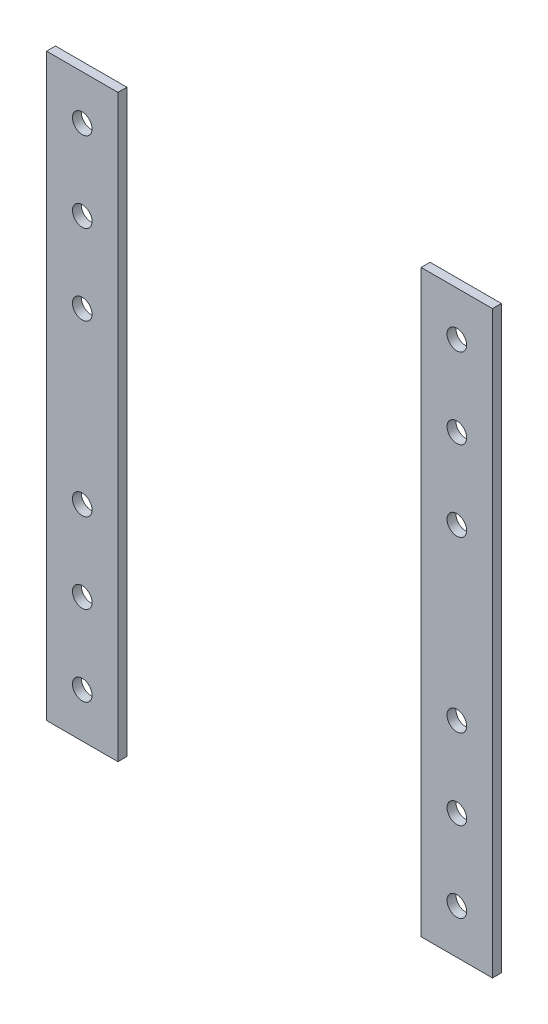
ISO-10303-21;
HEADER;
FILE_DESCRIPTION(('STEP AP214'),'2;1');
FILE_NAME('part.step','',(''),(''),'','','');
FILE_SCHEMA(('AUTOMOTIVE_DESIGN { 1 0 10303 214 1 1 1 1 }'));
ENDSEC;
DATA;
#1=APPLICATION_CONTEXT('core data for automotive mechanical design processes');
#2=APPLICATION_PROTOCOL_DEFINITION('international standard','automotive_design',2000,#1);
#3=PRODUCT_CONTEXT('',#1,'mechanical');
#4=PRODUCT('Part','Part','',(#3));
#5=PRODUCT_RELATED_PRODUCT_CATEGORY('part','',(#4));
#6=PRODUCT_DEFINITION_FORMATION('','',#4);
#7=PRODUCT_DEFINITION_CONTEXT('part definition',#1,'design');
#8=PRODUCT_DEFINITION('design','',#6,#7);
#9=PRODUCT_DEFINITION_SHAPE('','',#8);
#10=(LENGTH_UNIT() NAMED_UNIT(*) SI_UNIT(.MILLI.,.METRE.));
#11=(NAMED_UNIT(*) PLANE_ANGLE_UNIT() SI_UNIT($,.RADIAN.));
#12=(NAMED_UNIT(*) SI_UNIT($,.STERADIAN.) SOLID_ANGLE_UNIT());
#13=UNCERTAINTY_MEASURE_WITH_UNIT(LENGTH_MEASURE(1.E-05),#10,'distance_accuracy_value','');
#14=(GEOMETRIC_REPRESENTATION_CONTEXT(3) GLOBAL_UNCERTAINTY_ASSIGNED_CONTEXT((#13)) GLOBAL_UNIT_ASSIGNED_CONTEXT((#10,
#11,#12)) REPRESENTATION_CONTEXT('',''));
#15=CARTESIAN_POINT('',(0.,0.,0.));
#16=DIRECTION('',(0.,0.,1.));
#17=DIRECTION('',(1.,0.,0.));
#18=AXIS2_PLACEMENT_3D('',#15,#16,#17);
#19=CARTESIAN_POINT('',(0.,0.,-1550.05000079646));
#20=DIRECTION('',(0.,0.,-1.));
#21=DIRECTION('',(-1.,0.,0.));
#22=AXIS2_PLACEMENT_3D('',#19,#20,#21);
#23=PLANE('',#22);
#24=CARTESIAN_POINT('',(42.0000000000001,845.,-1550.05000079646));
#25=DIRECTION('',(0.,0.,1.));
#26=DIRECTION('',(1.,0.,0.));
#27=AXIS2_PLACEMENT_3D('',#24,#25,#26);
#28=CIRCLE('',#27,2.19999999999999);
#29=CARTESIAN_POINT('',(44.2000000000001,845.,-1550.05000079646));
#30=VERTEX_POINT('',#29);
#31=EDGE_CURVE('E367',#30,#30,#28,.T.);
#32=ORIENTED_EDGE('',*,*,#31,.F.);
#33=EDGE_LOOP('',(#32));
#34=FACE_BOUND('',#33,.T.);
#35=CARTESIAN_POINT('',(42.0000000000001,827.,-1550.05000079646));
#36=DIRECTION('',(0.,0.,1.));
#37=DIRECTION('',(1.,0.,0.));
#38=AXIS2_PLACEMENT_3D('',#35,#36,#37);
#39=CIRCLE('',#38,2.19999999999999);
#40=CARTESIAN_POINT('',(44.2000000000001,827.,-1550.05000079646));
#41=VERTEX_POINT('',#40);
#42=EDGE_CURVE('E371',#41,#41,#39,.T.);
#43=ORIENTED_EDGE('',*,*,#42,.F.);
#44=EDGE_LOOP('',(#43));
#45=FACE_BOUND('',#44,.T.);
#46=CARTESIAN_POINT('',(42.0000000000001,809.,-1550.05000079646));
#47=DIRECTION('',(0.,0.,1.));
#48=DIRECTION('',(1.,0.,0.));
#49=AXIS2_PLACEMENT_3D('',#46,#47,#48);
#50=CIRCLE('',#49,2.19999999999999);
#51=CARTESIAN_POINT('',(44.2000000000001,809.,-1550.05000079646));
#52=VERTEX_POINT('',#51);
#53=EDGE_CURVE('E380',#52,#52,#50,.T.);
#54=ORIENTED_EDGE('',*,*,#53,.F.);
#55=EDGE_LOOP('',(#54));
#56=FACE_BOUND('',#55,.T.);
#57=CARTESIAN_POINT('',(42.0000000000001,771.,-1550.05000079646));
#58=DIRECTION('',(0.,0.,1.));
#59=DIRECTION('',(1.,0.,0.));
#60=AXIS2_PLACEMENT_3D('',#57,#58,#59);
#61=CIRCLE('',#60,2.19999999999999);
#62=CARTESIAN_POINT('',(44.2000000000001,771.,-1550.05000079646));
#63=VERTEX_POINT('',#62);
#64=EDGE_CURVE('E386',#63,#63,#61,.T.);
#65=ORIENTED_EDGE('',*,*,#64,.F.);
#66=EDGE_LOOP('',(#65));
#67=FACE_BOUND('',#66,.T.);
#68=CARTESIAN_POINT('',(42.0000000000001,753.,-1550.05000079646));
#69=DIRECTION('',(0.,0.,1.));
#70=DIRECTION('',(1.,0.,0.));
#71=AXIS2_PLACEMENT_3D('',#68,#69,#70);
#72=CIRCLE('',#71,2.19999999999999);
#73=CARTESIAN_POINT('',(44.2000000000001,753.,-1550.05000079646));
#74=VERTEX_POINT('',#73);
#75=EDGE_CURVE('E392',#74,#74,#72,.T.);
#76=ORIENTED_EDGE('',*,*,#75,.F.);
#77=EDGE_LOOP('',(#76));
#78=FACE_BOUND('',#77,.T.);
#79=CARTESIAN_POINT('',(42.0000000000001,735.,-1550.05000079646));
#80=DIRECTION('',(0.,0.,1.));
#81=DIRECTION('',(1.,0.,0.));
#82=AXIS2_PLACEMENT_3D('',#79,#80,#81);
#83=CIRCLE('',#82,2.19999999999999);
#84=CARTESIAN_POINT('',(44.2000000000001,735.,-1550.05000079646));
#85=VERTEX_POINT('',#84);
#86=EDGE_CURVE('E273',#85,#85,#83,.T.);
#87=ORIENTED_EDGE('',*,*,#86,.F.);
#88=EDGE_LOOP('',(#87));
#89=FACE_BOUND('',#88,.T.);
#90=DIRECTION('',(-1.,0.,0.));
#91=VECTOR('',#90,1.);
#92=CARTESIAN_POINT('',(50.0000000000001,855.,-1550.05000079646));
#93=LINE('',#92,#91);
#94=CARTESIAN_POINT('',(50.0000000000001,855.,-1550.05000079646));
#95=VERTEX_POINT('',#94);
#96=CARTESIAN_POINT('',(34.0000000000001,855.,-1550.05000079646));
#97=VERTEX_POINT('',#96);
#98=EDGE_CURVE('E226',#95,#97,#93,.T.);
#99=ORIENTED_EDGE('',*,*,#98,.T.);
#100=DIRECTION('',(0.,-1.,0.));
#101=VECTOR('',#100,1.);
#102=CARTESIAN_POINT('',(34.0000000000001,855.,-1550.05000079646));
#103=LINE('',#102,#101);
#104=CARTESIAN_POINT('',(34.0000000000001,725.,-1550.05000079646));
#105=VERTEX_POINT('',#104);
#106=EDGE_CURVE('E283',#97,#105,#103,.T.);
#107=ORIENTED_EDGE('',*,*,#106,.T.);
#108=DIRECTION('',(-1.,0.,0.));
#109=VECTOR('',#108,1.);
#110=CARTESIAN_POINT('',(50.0000000000001,725.,-1550.05000079646));
#111=LINE('',#110,#109);
#112=CARTESIAN_POINT('',(50.0000000000001,725.,-1550.05000079646));
#113=VERTEX_POINT('',#112);
#114=EDGE_CURVE('E272',#113,#105,#111,.T.);
#115=ORIENTED_EDGE('',*,*,#114,.F.);
#116=DIRECTION('',(0.,-1.,0.));
#117=VECTOR('',#116,1.);
#118=CARTESIAN_POINT('',(50.0000000000001,855.,-1550.05000079646));
#119=LINE('',#118,#117);
#120=EDGE_CURVE('E255',#95,#113,#119,.T.);
#121=ORIENTED_EDGE('',*,*,#120,.F.);
#122=EDGE_LOOP('',(#99,#107,#115,#121));
#123=FACE_BOUND('',#122,.T.);
#124=ADVANCED_FACE('F217',(#34,#45,#56,#67,#78,#89,#123),#23,.F.);
#125=CARTESIAN_POINT('',(0.,0.,-1552.05000079646));
#126=DIRECTION('',(0.,0.,-1.));
#127=DIRECTION('',(-1.,0.,0.));
#128=AXIS2_PLACEMENT_3D('',#125,#126,#127);
#129=PLANE('',#128);
#130=CARTESIAN_POINT('',(42.0000000000001,845.,-1552.05000079646));
#131=DIRECTION('',(0.,0.,1.));
#132=DIRECTION('',(1.,0.,0.));
#133=AXIS2_PLACEMENT_3D('',#130,#131,#132);
#134=CIRCLE('',#133,2.19999999999999);
#135=CARTESIAN_POINT('',(44.2000000000001,845.,-1552.05000079646));
#136=VERTEX_POINT('',#135);
#137=EDGE_CURVE('E364',#136,#136,#134,.T.);
#138=ORIENTED_EDGE('',*,*,#137,.T.);
#139=EDGE_LOOP('',(#138));
#140=FACE_BOUND('',#139,.T.);
#141=CARTESIAN_POINT('',(42.0000000000001,827.,-1552.05000079646));
#142=DIRECTION('',(0.,0.,1.));
#143=DIRECTION('',(1.,0.,0.));
#144=AXIS2_PLACEMENT_3D('',#141,#142,#143);
#145=CIRCLE('',#144,2.19999999999999);
#146=CARTESIAN_POINT('',(44.2000000000001,827.,-1552.05000079646));
#147=VERTEX_POINT('',#146);
#148=EDGE_CURVE('E368',#147,#147,#145,.T.);
#149=ORIENTED_EDGE('',*,*,#148,.T.);
#150=EDGE_LOOP('',(#149));
#151=FACE_BOUND('',#150,.T.);
#152=CARTESIAN_POINT('',(42.0000000000001,809.,-1552.05000079646));
#153=DIRECTION('',(0.,0.,1.));
#154=DIRECTION('',(1.,0.,0.));
#155=AXIS2_PLACEMENT_3D('',#152,#153,#154);
#156=CIRCLE('',#155,2.19999999999999);
#157=CARTESIAN_POINT('',(44.2000000000001,809.,-1552.05000079646));
#158=VERTEX_POINT('',#157);
#159=EDGE_CURVE('E377',#158,#158,#156,.T.);
#160=ORIENTED_EDGE('',*,*,#159,.T.);
#161=EDGE_LOOP('',(#160));
#162=FACE_BOUND('',#161,.T.);
#163=CARTESIAN_POINT('',(42.0000000000001,771.,-1552.05000079646));
#164=DIRECTION('',(0.,0.,1.));
#165=DIRECTION('',(1.,0.,0.));
#166=AXIS2_PLACEMENT_3D('',#163,#164,#165);
#167=CIRCLE('',#166,2.19999999999999);
#168=CARTESIAN_POINT('',(44.2000000000001,771.,-1552.05000079646));
#169=VERTEX_POINT('',#168);
#170=EDGE_CURVE('E383',#169,#169,#167,.T.);
#171=ORIENTED_EDGE('',*,*,#170,.T.);
#172=EDGE_LOOP('',(#171));
#173=FACE_BOUND('',#172,.T.);
#174=CARTESIAN_POINT('',(42.0000000000001,753.,-1552.05000079646));
#175=DIRECTION('',(0.,0.,1.));
#176=DIRECTION('',(1.,0.,0.));
#177=AXIS2_PLACEMENT_3D('',#174,#175,#176);
#178=CIRCLE('',#177,2.19999999999999);
#179=CARTESIAN_POINT('',(44.2000000000001,753.,-1552.05000079646));
#180=VERTEX_POINT('',#179);
#181=EDGE_CURVE('E389',#180,#180,#178,.T.);
#182=ORIENTED_EDGE('',*,*,#181,.T.);
#183=EDGE_LOOP('',(#182));
#184=FACE_BOUND('',#183,.T.);
#185=CARTESIAN_POINT('',(42.0000000000001,735.,-1552.05000079646));
#186=DIRECTION('',(0.,0.,1.));
#187=DIRECTION('',(1.,0.,0.));
#188=AXIS2_PLACEMENT_3D('',#185,#186,#187);
#189=CIRCLE('',#188,2.19999999999999);
#190=CARTESIAN_POINT('',(44.2000000000001,735.,-1552.05000079646));
#191=VERTEX_POINT('',#190);
#192=EDGE_CURVE('E276',#191,#191,#189,.T.);
#193=ORIENTED_EDGE('',*,*,#192,.T.);
#194=EDGE_LOOP('',(#193));
#195=FACE_BOUND('',#194,.T.);
#196=DIRECTION('',(-1.,0.,0.));
#197=VECTOR('',#196,1.);
#198=CARTESIAN_POINT('',(50.0000000000001,855.,-1552.05000079646));
#199=LINE('',#198,#197);
#200=CARTESIAN_POINT('',(50.0000000000001,855.,-1552.05000079646));
#201=VERTEX_POINT('',#200);
#202=CARTESIAN_POINT('',(34.0000000000001,855.,-1552.05000079646));
#203=VERTEX_POINT('',#202);
#204=EDGE_CURVE('E13',#201,#203,#199,.T.);
#205=ORIENTED_EDGE('',*,*,#204,.F.);
#206=DIRECTION('',(0.,-1.,0.));
#207=VECTOR('',#206,1.);
#208=CARTESIAN_POINT('',(50.0000000000001,855.,-1552.05000079646));
#209=LINE('',#208,#207);
#210=CARTESIAN_POINT('',(50.0000000000001,725.,-1552.05000079646));
#211=VERTEX_POINT('',#210);
#212=EDGE_CURVE('E269',#201,#211,#209,.T.);
#213=ORIENTED_EDGE('',*,*,#212,.T.);
#214=DIRECTION('',(-1.,0.,0.));
#215=VECTOR('',#214,1.);
#216=CARTESIAN_POINT('',(50.0000000000001,725.,-1552.05000079646));
#217=LINE('',#216,#215);
#218=CARTESIAN_POINT('',(34.0000000000001,725.,-1552.05000079646));
#219=VERTEX_POINT('',#218);
#220=EDGE_CURVE('E290',#211,#219,#217,.T.);
#221=ORIENTED_EDGE('',*,*,#220,.T.);
#222=DIRECTION('',(0.,-1.,0.));
#223=VECTOR('',#222,1.);
#224=CARTESIAN_POINT('',(34.0000000000001,855.,-1552.05000079646));
#225=LINE('',#224,#223);
#226=EDGE_CURVE('E265',#203,#219,#225,.T.);
#227=ORIENTED_EDGE('',*,*,#226,.F.);
#228=EDGE_LOOP('',(#205,#213,#221,#227));
#229=FACE_BOUND('',#228,.T.);
#230=ADVANCED_FACE('F317',(#140,#151,#162,#173,#184,#195,#229),#129,.T.);
#231=CARTESIAN_POINT('',(50.0000000000001,855.,-1552.05000079646));
#232=DIRECTION('',(-1.,0.,0.));
#233=DIRECTION('',(0.,0.,1.));
#234=AXIS2_PLACEMENT_3D('',#231,#232,#233);
#235=PLANE('',#234);
#236=ORIENTED_EDGE('',*,*,#120,.T.);
#237=DIRECTION('',(0.,0.,1.));
#238=VECTOR('',#237,1.);
#239=CARTESIAN_POINT('',(50.0000000000001,725.,-1552.05000079646));
#240=LINE('',#239,#238);
#241=EDGE_CURVE('E298',#211,#113,#240,.T.);
#242=ORIENTED_EDGE('',*,*,#241,.F.);
#243=ORIENTED_EDGE('',*,*,#212,.F.);
#244=DIRECTION('',(0.,0.,1.));
#245=VECTOR('',#244,1.);
#246=CARTESIAN_POINT('',(50.0000000000001,855.,-1552.05000079646));
#247=LINE('',#246,#245);
#248=EDGE_CURVE('E260',#201,#95,#247,.T.);
#249=ORIENTED_EDGE('',*,*,#248,.T.);
#250=EDGE_LOOP('',(#236,#242,#243,#249));
#251=FACE_BOUND('',#250,.T.);
#252=ADVANCED_FACE('F267',(#251),#235,.F.);
#253=CARTESIAN_POINT('',(50.0000000000001,725.,-1552.05000079646));
#254=DIRECTION('',(0.,1.,0.));
#255=DIRECTION('',(0.,0.,1.));
#256=AXIS2_PLACEMENT_3D('',#253,#254,#255);
#257=PLANE('',#256);
#258=ORIENTED_EDGE('',*,*,#114,.T.);
#259=DIRECTION('',(0.,0.,1.));
#260=VECTOR('',#259,1.);
#261=CARTESIAN_POINT('',(34.0000000000001,725.,-1552.05000079646));
#262=LINE('',#261,#260);
#263=EDGE_CURVE('E285',#219,#105,#262,.T.);
#264=ORIENTED_EDGE('',*,*,#263,.F.);
#265=ORIENTED_EDGE('',*,*,#220,.F.);
#266=ORIENTED_EDGE('',*,*,#241,.T.);
#267=EDGE_LOOP('',(#258,#264,#265,#266));
#268=FACE_BOUND('',#267,.T.);
#269=ADVANCED_FACE('F316',(#268),#257,.F.);
#270=CARTESIAN_POINT('',(50.0000000000001,855.,-1552.05000079646));
#271=DIRECTION('',(0.,1.,0.));
#272=DIRECTION('',(0.,0.,1.));
#273=AXIS2_PLACEMENT_3D('',#270,#271,#272);
#274=PLANE('',#273);
#275=ORIENTED_EDGE('',*,*,#98,.F.);
#276=ORIENTED_EDGE('',*,*,#248,.F.);
#277=ORIENTED_EDGE('',*,*,#204,.T.);
#278=DIRECTION('',(0.,0.,1.));
#279=VECTOR('',#278,1.);
#280=CARTESIAN_POINT('',(34.0000000000001,855.,-1552.05000079646));
#281=LINE('',#280,#279);
#282=EDGE_CURVE('E262',#203,#97,#281,.T.);
#283=ORIENTED_EDGE('',*,*,#282,.T.);
#284=EDGE_LOOP('',(#275,#276,#277,#283));
#285=FACE_BOUND('',#284,.T.);
#286=ADVANCED_FACE('F259',(#285),#274,.T.);
#287=CARTESIAN_POINT('',(34.0000000000001,855.,-1552.05000079646));
#288=DIRECTION('',(-1.,0.,0.));
#289=DIRECTION('',(0.,0.,1.));
#290=AXIS2_PLACEMENT_3D('',#287,#288,#289);
#291=PLANE('',#290);
#292=ORIENTED_EDGE('',*,*,#106,.F.);
#293=ORIENTED_EDGE('',*,*,#282,.F.);
#294=ORIENTED_EDGE('',*,*,#226,.T.);
#295=ORIENTED_EDGE('',*,*,#263,.T.);
#296=EDGE_LOOP('',(#292,#293,#294,#295));
#297=FACE_BOUND('',#296,.T.);
#298=ADVANCED_FACE('F315',(#297),#291,.T.);
#299=CARTESIAN_POINT('',(42.0000000000001,735.,-1552.05000079646));
#300=DIRECTION('',(0.,0.,1.));
#301=DIRECTION('',(1.,0.,0.));
#302=AXIS2_PLACEMENT_3D('',#299,#300,#301);
#303=CYLINDRICAL_SURFACE('',#302,2.19999999999999);
#304=ORIENTED_EDGE('',*,*,#192,.F.);
#305=EDGE_LOOP('',(#304));
#306=FACE_BOUND('',#305,.T.);
#307=ORIENTED_EDGE('',*,*,#86,.T.);
#308=EDGE_LOOP('',(#307));
#309=FACE_BOUND('',#308,.T.);
#310=ADVANCED_FACE('F326',(#306,#309),#303,.F.);
#311=CARTESIAN_POINT('',(42.0000000000001,753.,-1552.05000079646));
#312=DIRECTION('',(0.,0.,1.));
#313=DIRECTION('',(1.,0.,0.));
#314=AXIS2_PLACEMENT_3D('',#311,#312,#313);
#315=CYLINDRICAL_SURFACE('',#314,2.19999999999999);
#316=ORIENTED_EDGE('',*,*,#181,.F.);
#317=EDGE_LOOP('',(#316));
#318=FACE_BOUND('',#317,.T.);
#319=ORIENTED_EDGE('',*,*,#75,.T.);
#320=EDGE_LOOP('',(#319));
#321=FACE_BOUND('',#320,.T.);
#322=ADVANCED_FACE('F336',(#318,#321),#315,.F.);
#323=CARTESIAN_POINT('',(42.0000000000001,771.,-1552.05000079646));
#324=DIRECTION('',(0.,0.,1.));
#325=DIRECTION('',(1.,0.,0.));
#326=AXIS2_PLACEMENT_3D('',#323,#324,#325);
#327=CYLINDRICAL_SURFACE('',#326,2.19999999999999);
#328=ORIENTED_EDGE('',*,*,#170,.F.);
#329=EDGE_LOOP('',(#328));
#330=FACE_BOUND('',#329,.T.);
#331=ORIENTED_EDGE('',*,*,#64,.T.);
#332=EDGE_LOOP('',(#331));
#333=FACE_BOUND('',#332,.T.);
#334=ADVANCED_FACE('F344',(#330,#333),#327,.F.);
#335=CARTESIAN_POINT('',(42.0000000000001,809.,-1552.05000079646));
#336=DIRECTION('',(0.,0.,1.));
#337=DIRECTION('',(1.,0.,0.));
#338=AXIS2_PLACEMENT_3D('',#335,#336,#337);
#339=CYLINDRICAL_SURFACE('',#338,2.19999999999999);
#340=ORIENTED_EDGE('',*,*,#159,.F.);
#341=EDGE_LOOP('',(#340));
#342=FACE_BOUND('',#341,.T.);
#343=ORIENTED_EDGE('',*,*,#53,.T.);
#344=EDGE_LOOP('',(#343));
#345=FACE_BOUND('',#344,.T.);
#346=ADVANCED_FACE('F348',(#342,#345),#339,.F.);
#347=CARTESIAN_POINT('',(42.0000000000001,827.,-1552.05000079646));
#348=DIRECTION('',(0.,0.,1.));
#349=DIRECTION('',(1.,0.,0.));
#350=AXIS2_PLACEMENT_3D('',#347,#348,#349);
#351=CYLINDRICAL_SURFACE('',#350,2.19999999999999);
#352=ORIENTED_EDGE('',*,*,#148,.F.);
#353=EDGE_LOOP('',(#352));
#354=FACE_BOUND('',#353,.T.);
#355=ORIENTED_EDGE('',*,*,#42,.T.);
#356=EDGE_LOOP('',(#355));
#357=FACE_BOUND('',#356,.T.);
#358=ADVANCED_FACE('F352',(#354,#357),#351,.F.);
#359=CARTESIAN_POINT('',(42.0000000000001,845.,-1552.05000079646));
#360=DIRECTION('',(0.,0.,1.));
#361=DIRECTION('',(1.,0.,0.));
#362=AXIS2_PLACEMENT_3D('',#359,#360,#361);
#363=CYLINDRICAL_SURFACE('',#362,2.19999999999999);
#364=ORIENTED_EDGE('',*,*,#137,.F.);
#365=EDGE_LOOP('',(#364));
#366=FACE_BOUND('',#365,.T.);
#367=ORIENTED_EDGE('',*,*,#31,.T.);
#368=EDGE_LOOP('',(#367));
#369=FACE_BOUND('',#368,.T.);
#370=ADVANCED_FACE('F356',(#366,#369),#363,.F.);
#371=CLOSED_SHELL('',(#124,#230,#252,#269,#286,#298,#310,#322,#334,#346,#358,#370));
#372=MANIFOLD_SOLID_BREP('B2',#371);
#373=CARTESIAN_POINT('',(0.,0.,-1550.05000079646));
#374=DIRECTION('',(0.,0.,-1.));
#375=DIRECTION('',(-1.,0.,0.));
#376=AXIS2_PLACEMENT_3D('',#373,#374,#375);
#377=PLANE('',#376);
#378=CARTESIAN_POINT('',(-42.0000000000001,735.,-1550.05000079646));
#379=DIRECTION('',(0.,0.,1.));
#380=DIRECTION('',(1.,0.,0.));
#381=AXIS2_PLACEMENT_3D('',#378,#379,#380);
#382=CIRCLE('',#381,2.19999999999999);
#383=CARTESIAN_POINT('',(-39.8000000000001,735.,-1550.05000079646));
#384=VERTEX_POINT('',#383);
#385=EDGE_CURVE('E618',#384,#384,#382,.T.);
#386=ORIENTED_EDGE('',*,*,#385,.F.);
#387=EDGE_LOOP('',(#386));
#388=FACE_BOUND('',#387,.T.);
#389=CARTESIAN_POINT('',(-42.0000000000001,753.,-1550.05000079646));
#390=DIRECTION('',(0.,0.,1.));
#391=DIRECTION('',(1.,0.,0.));
#392=AXIS2_PLACEMENT_3D('',#389,#390,#391);
#393=CIRCLE('',#392,2.19999999999999);
#394=CARTESIAN_POINT('',(-39.8000000000001,753.,-1550.05000079646));
#395=VERTEX_POINT('',#394);
#396=EDGE_CURVE('E612',#395,#395,#393,.T.);
#397=ORIENTED_EDGE('',*,*,#396,.F.);
#398=EDGE_LOOP('',(#397));
#399=FACE_BOUND('',#398,.T.);
#400=CARTESIAN_POINT('',(-42.0000000000001,771.,-1550.05000079646));
#401=DIRECTION('',(0.,0.,1.));
#402=DIRECTION('',(1.,0.,0.));
#403=AXIS2_PLACEMENT_3D('',#400,#401,#402);
#404=CIRCLE('',#403,2.19999999999999);
#405=CARTESIAN_POINT('',(-39.8000000000001,771.,-1550.05000079646));
#406=VERTEX_POINT('',#405);
#407=EDGE_CURVE('E606',#406,#406,#404,.T.);
#408=ORIENTED_EDGE('',*,*,#407,.F.);
#409=EDGE_LOOP('',(#408));
#410=FACE_BOUND('',#409,.T.);
#411=CARTESIAN_POINT('',(-42.0000000000001,809.,-1550.05000079646));
#412=DIRECTION('',(0.,0.,1.));
#413=DIRECTION('',(1.,0.,0.));
#414=AXIS2_PLACEMENT_3D('',#411,#412,#413);
#415=CIRCLE('',#414,2.19999999999999);
#416=CARTESIAN_POINT('',(-39.8000000000001,809.,-1550.05000079646));
#417=VERTEX_POINT('',#416);
#418=EDGE_CURVE('E600',#417,#417,#415,.T.);
#419=ORIENTED_EDGE('',*,*,#418,.F.);
#420=EDGE_LOOP('',(#419));
#421=FACE_BOUND('',#420,.T.);
#422=CARTESIAN_POINT('',(-42.0000000000001,827.,-1550.05000079646));
#423=DIRECTION('',(0.,0.,1.));
#424=DIRECTION('',(1.,0.,0.));
#425=AXIS2_PLACEMENT_3D('',#422,#423,#424);
#426=CIRCLE('',#425,2.19999999999999);
#427=CARTESIAN_POINT('',(-39.8000000000001,827.,-1550.05000079646));
#428=VERTEX_POINT('',#427);
#429=EDGE_CURVE('E594',#428,#428,#426,.T.);
#430=ORIENTED_EDGE('',*,*,#429,.F.);
#431=EDGE_LOOP('',(#430));
#432=FACE_BOUND('',#431,.T.);
#433=CARTESIAN_POINT('',(-42.0000000000001,845.,-1550.05000079646));
#434=DIRECTION('',(0.,0.,1.));
#435=DIRECTION('',(1.,0.,0.));
#436=AXIS2_PLACEMENT_3D('',#433,#434,#435);
#437=CIRCLE('',#436,2.19999999999999);
#438=CARTESIAN_POINT('',(-39.8000000000001,845.,-1550.05000079646));
#439=VERTEX_POINT('',#438);
#440=EDGE_CURVE('E563',#439,#439,#437,.T.);
#441=ORIENTED_EDGE('',*,*,#440,.F.);
#442=EDGE_LOOP('',(#441));
#443=FACE_BOUND('',#442,.T.);
#444=DIRECTION('',(0.,-1.,0.));
#445=VECTOR('',#444,1.);
#446=CARTESIAN_POINT('',(-50.0000000000001,855.,-1550.05000079646));
#447=LINE('',#446,#445);
#448=CARTESIAN_POINT('',(-50.0000000000001,855.,-1550.05000079646));
#449=VERTEX_POINT('',#448);
#450=CARTESIAN_POINT('',(-50.0000000000001,725.,-1550.05000079646));
#451=VERTEX_POINT('',#450);
#452=EDGE_CURVE('E520',#449,#451,#447,.T.);
#453=ORIENTED_EDGE('',*,*,#452,.T.);
#454=DIRECTION('',(1.,0.,0.));
#455=VECTOR('',#454,1.);
#456=CARTESIAN_POINT('',(-50.0000000000001,725.,-1550.05000079646));
#457=LINE('',#456,#455);
#458=CARTESIAN_POINT('',(-34.0000000000001,725.,-1550.05000079646));
#459=VERTEX_POINT('',#458);
#460=EDGE_CURVE('E526',#451,#459,#457,.T.);
#461=ORIENTED_EDGE('',*,*,#460,.T.);
#462=DIRECTION('',(0.,-1.,0.));
#463=VECTOR('',#462,1.);
#464=CARTESIAN_POINT('',(-34.0000000000001,855.,-1550.05000079646));
#465=LINE('',#464,#463);
#466=CARTESIAN_POINT('',(-34.0000000000001,855.,-1550.05000079646));
#467=VERTEX_POINT('',#466);
#468=EDGE_CURVE('E550',#467,#459,#465,.T.);
#469=ORIENTED_EDGE('',*,*,#468,.F.);
#470=DIRECTION('',(1.,0.,0.));
#471=VECTOR('',#470,1.);
#472=CARTESIAN_POINT('',(-50.0000000000001,855.,-1550.05000079646));
#473=LINE('',#472,#471);
#474=EDGE_CURVE('E500',#449,#467,#473,.T.);
#475=ORIENTED_EDGE('',*,*,#474,.F.);
#476=EDGE_LOOP('',(#453,#461,#469,#475));
#477=FACE_BOUND('',#476,.T.);
#478=ADVANCED_FACE('F491',(#388,#399,#410,#421,#432,#443,#477),#377,.F.);
#479=CARTESIAN_POINT('',(0.,0.,-1552.05000079646));
#480=DIRECTION('',(0.,0.,-1.));
#481=DIRECTION('',(-1.,0.,0.));
#482=AXIS2_PLACEMENT_3D('',#479,#480,#481);
#483=PLANE('',#482);
#484=CARTESIAN_POINT('',(-42.0000000000001,735.,-1552.05000079646));
#485=DIRECTION('',(0.,0.,1.));
#486=DIRECTION('',(1.,0.,0.));
#487=AXIS2_PLACEMENT_3D('',#484,#485,#486);
#488=CIRCLE('',#487,2.19999999999999);
#489=CARTESIAN_POINT('',(-39.8000000000001,735.,-1552.05000079646));
#490=VERTEX_POINT('',#489);
#491=EDGE_CURVE('E621',#490,#490,#488,.T.);
#492=ORIENTED_EDGE('',*,*,#491,.T.);
#493=EDGE_LOOP('',(#492));
#494=FACE_BOUND('',#493,.T.);
#495=CARTESIAN_POINT('',(-42.0000000000001,753.,-1552.05000079646));
#496=DIRECTION('',(0.,0.,1.));
#497=DIRECTION('',(1.,0.,0.));
#498=AXIS2_PLACEMENT_3D('',#495,#496,#497);
#499=CIRCLE('',#498,2.19999999999999);
#500=CARTESIAN_POINT('',(-39.8000000000001,753.,-1552.05000079646));
#501=VERTEX_POINT('',#500);
#502=EDGE_CURVE('E615',#501,#501,#499,.T.);
#503=ORIENTED_EDGE('',*,*,#502,.T.);
#504=EDGE_LOOP('',(#503));
#505=FACE_BOUND('',#504,.T.);
#506=CARTESIAN_POINT('',(-42.0000000000001,771.,-1552.05000079646));
#507=DIRECTION('',(0.,0.,1.));
#508=DIRECTION('',(1.,0.,0.));
#509=AXIS2_PLACEMENT_3D('',#506,#507,#508);
#510=CIRCLE('',#509,2.19999999999999);
#511=CARTESIAN_POINT('',(-39.8000000000001,771.,-1552.05000079646));
#512=VERTEX_POINT('',#511);
#513=EDGE_CURVE('E609',#512,#512,#510,.T.);
#514=ORIENTED_EDGE('',*,*,#513,.T.);
#515=EDGE_LOOP('',(#514));
#516=FACE_BOUND('',#515,.T.);
#517=CARTESIAN_POINT('',(-42.0000000000001,809.,-1552.05000079646));
#518=DIRECTION('',(0.,0.,1.));
#519=DIRECTION('',(1.,0.,0.));
#520=AXIS2_PLACEMENT_3D('',#517,#518,#519);
#521=CIRCLE('',#520,2.19999999999999);
#522=CARTESIAN_POINT('',(-39.8000000000001,809.,-1552.05000079646));
#523=VERTEX_POINT('',#522);
#524=EDGE_CURVE('E603',#523,#523,#521,.T.);
#525=ORIENTED_EDGE('',*,*,#524,.T.);
#526=EDGE_LOOP('',(#525));
#527=FACE_BOUND('',#526,.T.);
#528=CARTESIAN_POINT('',(-42.0000000000001,827.,-1552.05000079646));
#529=DIRECTION('',(0.,0.,1.));
#530=DIRECTION('',(1.,0.,0.));
#531=AXIS2_PLACEMENT_3D('',#528,#529,#530);
#532=CIRCLE('',#531,2.19999999999999);
#533=CARTESIAN_POINT('',(-39.8000000000001,827.,-1552.05000079646));
#534=VERTEX_POINT('',#533);
#535=EDGE_CURVE('E597',#534,#534,#532,.T.);
#536=ORIENTED_EDGE('',*,*,#535,.T.);
#537=EDGE_LOOP('',(#536));
#538=FACE_BOUND('',#537,.T.);
#539=CARTESIAN_POINT('',(-42.0000000000001,845.,-1552.05000079646));
#540=DIRECTION('',(0.,0.,1.));
#541=DIRECTION('',(1.,0.,0.));
#542=AXIS2_PLACEMENT_3D('',#539,#540,#541);
#543=CIRCLE('',#542,2.19999999999999);
#544=CARTESIAN_POINT('',(-39.8000000000001,845.,-1552.05000079646));
#545=VERTEX_POINT('',#544);
#546=EDGE_CURVE('E591',#545,#545,#543,.T.);
#547=ORIENTED_EDGE('',*,*,#546,.T.);
#548=EDGE_LOOP('',(#547));
#549=FACE_BOUND('',#548,.T.);
#550=DIRECTION('',(0.,-1.,0.));
#551=VECTOR('',#550,1.);
#552=CARTESIAN_POINT('',(-50.0000000000001,855.,-1552.05000079646));
#553=LINE('',#552,#551);
#554=CARTESIAN_POINT('',(-50.0000000000001,855.,-1552.05000079646));
#555=VERTEX_POINT('',#554);
#556=CARTESIAN_POINT('',(-50.0000000000001,725.,-1552.05000079646));
#557=VERTEX_POINT('',#556);
#558=EDGE_CURVE('E508',#555,#557,#553,.T.);
#559=ORIENTED_EDGE('',*,*,#558,.F.);
#560=DIRECTION('',(1.,0.,0.));
#561=VECTOR('',#560,1.);
#562=CARTESIAN_POINT('',(-50.0000000000001,855.,-1552.05000079646));
#563=LINE('',#562,#561);
#564=CARTESIAN_POINT('',(-34.0000000000001,855.,-1552.05000079646));
#565=VERTEX_POINT('',#564);
#566=EDGE_CURVE('E215',#555,#565,#563,.T.);
#567=ORIENTED_EDGE('',*,*,#566,.T.);
#568=DIRECTION('',(0.,-1.,0.));
#569=VECTOR('',#568,1.);
#570=CARTESIAN_POINT('',(-34.0000000000001,855.,-1552.05000079646));
#571=LINE('',#570,#569);
#572=CARTESIAN_POINT('',(-34.0000000000001,725.,-1552.05000079646));
#573=VERTEX_POINT('',#572);
#574=EDGE_CURVE('E535',#565,#573,#571,.T.);
#575=ORIENTED_EDGE('',*,*,#574,.T.);
#576=DIRECTION('',(1.,0.,0.));
#577=VECTOR('',#576,1.);
#578=CARTESIAN_POINT('',(-50.0000000000001,725.,-1552.05000079646));
#579=LINE('',#578,#577);
#580=EDGE_CURVE('E569',#557,#573,#579,.T.);
#581=ORIENTED_EDGE('',*,*,#580,.F.);
#582=EDGE_LOOP('',(#559,#567,#575,#581));
#583=FACE_BOUND('',#582,.T.);
#584=ADVANCED_FACE('F534',(#494,#505,#516,#527,#538,#549,#583),#483,.T.);
#585=CARTESIAN_POINT('',(-50.0000000000001,855.,-1552.05000079646));
#586=DIRECTION('',(-1.,0.,0.));
#587=DIRECTION('',(0.,0.,1.));
#588=AXIS2_PLACEMENT_3D('',#585,#586,#587);
#589=PLANE('',#588);
#590=ORIENTED_EDGE('',*,*,#452,.F.);
#591=DIRECTION('',(0.,0.,1.));
#592=VECTOR('',#591,1.);
#593=CARTESIAN_POINT('',(-50.0000000000001,855.,-1552.05000079646));
#594=LINE('',#593,#592);
#595=EDGE_CURVE('E562',#555,#449,#594,.T.);
#596=ORIENTED_EDGE('',*,*,#595,.F.);
#597=ORIENTED_EDGE('',*,*,#558,.T.);
#598=DIRECTION('',(0.,0.,1.));
#599=VECTOR('',#598,1.);
#600=CARTESIAN_POINT('',(-50.0000000000001,725.,-1552.05000079646));
#601=LINE('',#600,#599);
#602=EDGE_CURVE('E576',#557,#451,#601,.T.);
#603=ORIENTED_EDGE('',*,*,#602,.T.);
#604=EDGE_LOOP('',(#590,#596,#597,#603));
#605=FACE_BOUND('',#604,.T.);
#606=ADVANCED_FACE('F662',(#605),#589,.T.);
#607=CARTESIAN_POINT('',(-50.0000000000001,725.,-1552.05000079646));
#608=DIRECTION('',(0.,-1.,0.));
#609=DIRECTION('',(0.,0.,-1.));
#610=AXIS2_PLACEMENT_3D('',#607,#608,#609);
#611=PLANE('',#610);
#612=ORIENTED_EDGE('',*,*,#460,.F.);
#613=ORIENTED_EDGE('',*,*,#602,.F.);
#614=ORIENTED_EDGE('',*,*,#580,.T.);
#615=DIRECTION('',(0.,0.,1.));
#616=VECTOR('',#615,1.);
#617=CARTESIAN_POINT('',(-34.0000000000001,725.,-1552.05000079646));
#618=LINE('',#617,#616);
#619=EDGE_CURVE('E546',#573,#459,#618,.T.);
#620=ORIENTED_EDGE('',*,*,#619,.T.);
#621=EDGE_LOOP('',(#612,#613,#614,#620));
#622=FACE_BOUND('',#621,.T.);
#623=ADVANCED_FACE('F665',(#622),#611,.T.);
#624=CARTESIAN_POINT('',(-50.0000000000001,855.,-1552.05000079646));
#625=DIRECTION('',(0.,-1.,0.));
#626=DIRECTION('',(0.,0.,-1.));
#627=AXIS2_PLACEMENT_3D('',#624,#625,#626);
#628=PLANE('',#627);
#629=ORIENTED_EDGE('',*,*,#474,.T.);
#630=DIRECTION('',(0.,0.,1.));
#631=VECTOR('',#630,1.);
#632=CARTESIAN_POINT('',(-34.0000000000001,855.,-1552.05000079646));
#633=LINE('',#632,#631);
#634=EDGE_CURVE('E544',#565,#467,#633,.T.);
#635=ORIENTED_EDGE('',*,*,#634,.F.);
#636=ORIENTED_EDGE('',*,*,#566,.F.);
#637=ORIENTED_EDGE('',*,*,#595,.T.);
#638=EDGE_LOOP('',(#629,#635,#636,#637));
#639=FACE_BOUND('',#638,.T.);
#640=ADVANCED_FACE('F549',(#639),#628,.F.);
#641=CARTESIAN_POINT('',(-34.0000000000001,855.,-1552.05000079646));
#642=DIRECTION('',(-1.,0.,0.));
#643=DIRECTION('',(0.,0.,1.));
#644=AXIS2_PLACEMENT_3D('',#641,#642,#643);
#645=PLANE('',#644);
#646=ORIENTED_EDGE('',*,*,#468,.T.);
#647=ORIENTED_EDGE('',*,*,#619,.F.);
#648=ORIENTED_EDGE('',*,*,#574,.F.);
#649=ORIENTED_EDGE('',*,*,#634,.T.);
#650=EDGE_LOOP('',(#646,#647,#648,#649));
#651=FACE_BOUND('',#650,.T.);
#652=ADVANCED_FACE('F543',(#651),#645,.F.);
#653=CARTESIAN_POINT('',(-42.0000000000001,845.,-1552.05000079646));
#654=DIRECTION('',(0.,0.,1.));
#655=DIRECTION('',(1.,0.,0.));
#656=AXIS2_PLACEMENT_3D('',#653,#654,#655);
#657=CYLINDRICAL_SURFACE('',#656,2.19999999999999);
#658=ORIENTED_EDGE('',*,*,#546,.F.);
#659=EDGE_LOOP('',(#658));
#660=FACE_BOUND('',#659,.T.);
#661=ORIENTED_EDGE('',*,*,#440,.T.);
#662=EDGE_LOOP('',(#661));
#663=FACE_BOUND('',#662,.T.);
#664=ADVANCED_FACE('F636',(#660,#663),#657,.F.);
#665=CARTESIAN_POINT('',(-42.0000000000001,827.,-1552.05000079646));
#666=DIRECTION('',(0.,0.,1.));
#667=DIRECTION('',(1.,0.,0.));
#668=AXIS2_PLACEMENT_3D('',#665,#666,#667);
#669=CYLINDRICAL_SURFACE('',#668,2.19999999999999);
#670=ORIENTED_EDGE('',*,*,#535,.F.);
#671=EDGE_LOOP('',(#670));
#672=FACE_BOUND('',#671,.T.);
#673=ORIENTED_EDGE('',*,*,#429,.T.);
#674=EDGE_LOOP('',(#673));
#675=FACE_BOUND('',#674,.T.);
#676=ADVANCED_FACE('F648',(#672,#675),#669,.F.);
#677=CARTESIAN_POINT('',(-42.0000000000001,809.,-1552.05000079646));
#678=DIRECTION('',(0.,0.,1.));
#679=DIRECTION('',(1.,0.,0.));
#680=AXIS2_PLACEMENT_3D('',#677,#678,#679);
#681=CYLINDRICAL_SURFACE('',#680,2.19999999999999);
#682=ORIENTED_EDGE('',*,*,#524,.F.);
#683=EDGE_LOOP('',(#682));
#684=FACE_BOUND('',#683,.T.);
#685=ORIENTED_EDGE('',*,*,#418,.T.);
#686=EDGE_LOOP('',(#685));
#687=FACE_BOUND('',#686,.T.);
#688=ADVANCED_FACE('F655',(#684,#687),#681,.F.);
#689=CARTESIAN_POINT('',(-42.0000000000001,771.,-1552.05000079646));
#690=DIRECTION('',(0.,0.,1.));
#691=DIRECTION('',(1.,0.,0.));
#692=AXIS2_PLACEMENT_3D('',#689,#690,#691);
#693=CYLINDRICAL_SURFACE('',#692,2.19999999999999);
#694=ORIENTED_EDGE('',*,*,#513,.F.);
#695=EDGE_LOOP('',(#694));
#696=FACE_BOUND('',#695,.T.);
#697=ORIENTED_EDGE('',*,*,#407,.T.);
#698=EDGE_LOOP('',(#697));
#699=FACE_BOUND('',#698,.T.);
#700=ADVANCED_FACE('F710',(#696,#699),#693,.F.);
#701=CARTESIAN_POINT('',(-42.0000000000001,753.,-1552.05000079646));
#702=DIRECTION('',(0.,0.,1.));
#703=DIRECTION('',(1.,0.,0.));
#704=AXIS2_PLACEMENT_3D('',#701,#702,#703);
#705=CYLINDRICAL_SURFACE('',#704,2.19999999999999);
#706=ORIENTED_EDGE('',*,*,#502,.F.);
#707=EDGE_LOOP('',(#706));
#708=FACE_BOUND('',#707,.T.);
#709=ORIENTED_EDGE('',*,*,#396,.T.);
#710=EDGE_LOOP('',(#709));
#711=FACE_BOUND('',#710,.T.);
#712=ADVANCED_FACE('F630',(#708,#711),#705,.F.);
#713=CARTESIAN_POINT('',(-42.0000000000001,735.,-1552.05000079646));
#714=DIRECTION('',(0.,0.,1.));
#715=DIRECTION('',(1.,0.,0.));
#716=AXIS2_PLACEMENT_3D('',#713,#714,#715);
#717=CYLINDRICAL_SURFACE('',#716,2.19999999999999);
#718=ORIENTED_EDGE('',*,*,#491,.F.);
#719=EDGE_LOOP('',(#718));
#720=FACE_BOUND('',#719,.T.);
#721=ORIENTED_EDGE('',*,*,#385,.T.);
#722=EDGE_LOOP('',(#721));
#723=FACE_BOUND('',#722,.T.);
#724=ADVANCED_FACE('F627',(#720,#723),#717,.F.);
#725=CLOSED_SHELL('',(#478,#584,#606,#623,#640,#652,#664,#676,#688,#700,#712,#724));
#726=MANIFOLD_SOLID_BREP('B7',#725);
#727=ADVANCED_BREP_SHAPE_REPRESENTATION('',(#18,#372,#726),#14);
#728=SHAPE_DEFINITION_REPRESENTATION(#9,#727);
ENDSEC;
END-ISO-10303-21;
